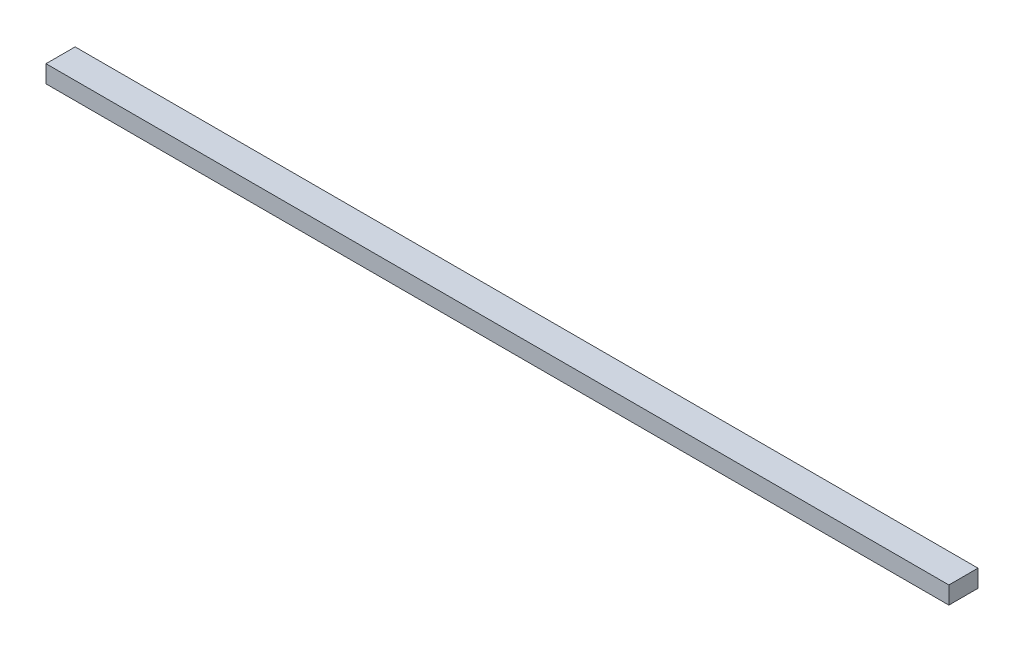
ISO-10303-21;
HEADER;
FILE_DESCRIPTION(('STEP AP214'),'2;1');
FILE_NAME('part.step','',(''),(''),'','','');
FILE_SCHEMA(('AUTOMOTIVE_DESIGN { 1 0 10303 214 1 1 1 1 }'));
ENDSEC;
DATA;
#1=APPLICATION_CONTEXT('core data for automotive mechanical design processes');
#2=APPLICATION_PROTOCOL_DEFINITION('international standard','automotive_design',2000,#1);
#3=PRODUCT_CONTEXT('',#1,'mechanical');
#4=PRODUCT('Part','Part','',(#3));
#5=PRODUCT_RELATED_PRODUCT_CATEGORY('part','',(#4));
#6=PRODUCT_DEFINITION_FORMATION('','',#4);
#7=PRODUCT_DEFINITION_CONTEXT('part definition',#1,'design');
#8=PRODUCT_DEFINITION('design','',#6,#7);
#9=PRODUCT_DEFINITION_SHAPE('','',#8);
#10=(LENGTH_UNIT() NAMED_UNIT(*) SI_UNIT(.MILLI.,.METRE.));
#11=(NAMED_UNIT(*) PLANE_ANGLE_UNIT() SI_UNIT($,.RADIAN.));
#12=(NAMED_UNIT(*) SI_UNIT($,.STERADIAN.) SOLID_ANGLE_UNIT());
#13=UNCERTAINTY_MEASURE_WITH_UNIT(LENGTH_MEASURE(1.E-05),#10,'distance_accuracy_value','');
#14=(GEOMETRIC_REPRESENTATION_CONTEXT(3) GLOBAL_UNCERTAINTY_ASSIGNED_CONTEXT((#13)) GLOBAL_UNIT_ASSIGNED_CONTEXT((#10,
#11,#12)) REPRESENTATION_CONTEXT('',''));
#15=CARTESIAN_POINT('',(0.,0.,0.));
#16=DIRECTION('',(0.,0.,1.));
#17=DIRECTION('',(1.,0.,0.));
#18=AXIS2_PLACEMENT_3D('',#15,#16,#17);
#19=CARTESIAN_POINT('',(77.5,3.,2.5));
#20=DIRECTION('',(-1.,0.,0.));
#21=DIRECTION('',(0.,0.,1.));
#22=AXIS2_PLACEMENT_3D('',#19,#20,#21);
#23=PLANE('',#22);
#24=DIRECTION('',(0.,0.,-1.));
#25=VECTOR('',#24,1.);
#26=CARTESIAN_POINT('',(77.5,0.,2.5));
#27=LINE('',#26,#25);
#28=CARTESIAN_POINT('',(77.5,0.,2.5));
#29=VERTEX_POINT('',#28);
#30=CARTESIAN_POINT('',(77.5,0.,-2.5));
#31=VERTEX_POINT('',#30);
#32=EDGE_CURVE('E94',#29,#31,#27,.T.);
#33=ORIENTED_EDGE('',*,*,#32,.T.);
#34=DIRECTION('',(0.,-1.,0.));
#35=VECTOR('',#34,1.);
#36=CARTESIAN_POINT('',(77.5,3.,-2.5));
#37=LINE('',#36,#35);
#38=CARTESIAN_POINT('',(77.5,3.,-2.5));
#39=VERTEX_POINT('',#38);
#40=EDGE_CURVE('E11',#39,#31,#37,.T.);
#41=ORIENTED_EDGE('',*,*,#40,.F.);
#42=DIRECTION('',(0.,0.,-1.));
#43=VECTOR('',#42,1.);
#44=CARTESIAN_POINT('',(77.5,3.,2.5));
#45=LINE('',#44,#43);
#46=CARTESIAN_POINT('',(77.5,3.,2.5));
#47=VERTEX_POINT('',#46);
#48=EDGE_CURVE('E82',#47,#39,#45,.T.);
#49=ORIENTED_EDGE('',*,*,#48,.F.);
#50=DIRECTION('',(0.,-1.,0.));
#51=VECTOR('',#50,1.);
#52=CARTESIAN_POINT('',(77.5,3.,2.5));
#53=LINE('',#52,#51);
#54=EDGE_CURVE('E90',#47,#29,#53,.T.);
#55=ORIENTED_EDGE('',*,*,#54,.T.);
#56=EDGE_LOOP('',(#33,#41,#49,#55));
#57=FACE_BOUND('',#56,.T.);
#58=ADVANCED_FACE('F31',(#57),#23,.F.);
#59=CARTESIAN_POINT('',(-77.5,3.,-2.5));
#60=DIRECTION('',(0.,0.,1.));
#61=DIRECTION('',(1.,0.,0.));
#62=AXIS2_PLACEMENT_3D('',#59,#60,#61);
#63=PLANE('',#62);
#64=DIRECTION('',(-1.,0.,0.));
#65=VECTOR('',#64,1.);
#66=CARTESIAN_POINT('',(-77.5,0.,-2.5));
#67=LINE('',#66,#65);
#68=CARTESIAN_POINT('',(-77.5,0.,-2.5));
#69=VERTEX_POINT('',#68);
#70=EDGE_CURVE('E86',#31,#69,#67,.T.);
#71=ORIENTED_EDGE('',*,*,#70,.T.);
#72=DIRECTION('',(0.,-1.,0.));
#73=VECTOR('',#72,1.);
#74=CARTESIAN_POINT('',(-77.5,3.,-2.5));
#75=LINE('',#74,#73);
#76=CARTESIAN_POINT('',(-77.5,3.,-2.5));
#77=VERTEX_POINT('',#76);
#78=EDGE_CURVE('E39',#77,#69,#75,.T.);
#79=ORIENTED_EDGE('',*,*,#78,.F.);
#80=DIRECTION('',(-1.,0.,0.));
#81=VECTOR('',#80,1.);
#82=CARTESIAN_POINT('',(-77.5,3.,-2.5));
#83=LINE('',#82,#81);
#84=EDGE_CURVE('E77',#39,#77,#83,.T.);
#85=ORIENTED_EDGE('',*,*,#84,.F.);
#86=ORIENTED_EDGE('',*,*,#40,.T.);
#87=EDGE_LOOP('',(#71,#79,#85,#86));
#88=FACE_BOUND('',#87,.T.);
#89=ADVANCED_FACE('F85',(#88),#63,.F.);
#90=CARTESIAN_POINT('',(-77.5,3.,2.5));
#91=DIRECTION('',(1.,0.,0.));
#92=DIRECTION('',(0.,0.,-1.));
#93=AXIS2_PLACEMENT_3D('',#90,#91,#92);
#94=PLANE('',#93);
#95=DIRECTION('',(0.,0.,1.));
#96=VECTOR('',#95,1.);
#97=CARTESIAN_POINT('',(-77.5,0.,2.5));
#98=LINE('',#97,#96);
#99=CARTESIAN_POINT('',(-77.5,0.,2.5));
#100=VERTEX_POINT('',#99);
#101=EDGE_CURVE('E64',#69,#100,#98,.T.);
#102=ORIENTED_EDGE('',*,*,#101,.T.);
#103=DIRECTION('',(0.,-1.,0.));
#104=VECTOR('',#103,1.);
#105=CARTESIAN_POINT('',(-77.5,3.,2.5));
#106=LINE('',#105,#104);
#107=CARTESIAN_POINT('',(-77.5,3.,2.5));
#108=VERTEX_POINT('',#107);
#109=EDGE_CURVE('E87',#108,#100,#106,.T.);
#110=ORIENTED_EDGE('',*,*,#109,.F.);
#111=DIRECTION('',(0.,0.,1.));
#112=VECTOR('',#111,1.);
#113=CARTESIAN_POINT('',(-77.5,3.,2.5));
#114=LINE('',#113,#112);
#115=EDGE_CURVE('E80',#77,#108,#114,.T.);
#116=ORIENTED_EDGE('',*,*,#115,.F.);
#117=ORIENTED_EDGE('',*,*,#78,.T.);
#118=EDGE_LOOP('',(#102,#110,#116,#117));
#119=FACE_BOUND('',#118,.T.);
#120=ADVANCED_FACE('F88',(#119),#94,.F.);
#121=CARTESIAN_POINT('',(-77.5,3.,2.5));
#122=DIRECTION('',(0.,0.,-1.));
#123=DIRECTION('',(-1.,0.,0.));
#124=AXIS2_PLACEMENT_3D('',#121,#122,#123);
#125=PLANE('',#124);
#126=DIRECTION('',(1.,0.,0.));
#127=VECTOR('',#126,1.);
#128=CARTESIAN_POINT('',(-77.5,0.,2.5));
#129=LINE('',#128,#127);
#130=EDGE_CURVE('E70',#100,#29,#129,.T.);
#131=ORIENTED_EDGE('',*,*,#130,.T.);
#132=ORIENTED_EDGE('',*,*,#54,.F.);
#133=DIRECTION('',(1.,0.,0.));
#134=VECTOR('',#133,1.);
#135=CARTESIAN_POINT('',(-77.5,3.,2.5));
#136=LINE('',#135,#134);
#137=EDGE_CURVE('E47',#108,#47,#136,.T.);
#138=ORIENTED_EDGE('',*,*,#137,.F.);
#139=ORIENTED_EDGE('',*,*,#109,.T.);
#140=EDGE_LOOP('',(#131,#132,#138,#139));
#141=FACE_BOUND('',#140,.T.);
#142=ADVANCED_FACE('F101',(#141),#125,.F.);
#143=CARTESIAN_POINT('',(77.5,3.,-2.5));
#144=DIRECTION('',(0.,-1.,0.));
#145=DIRECTION('',(0.,0.,-1.));
#146=AXIS2_PLACEMENT_3D('',#143,#144,#145);
#147=PLANE('',#146);
#148=ORIENTED_EDGE('',*,*,#48,.T.);
#149=ORIENTED_EDGE('',*,*,#84,.T.);
#150=ORIENTED_EDGE('',*,*,#115,.T.);
#151=ORIENTED_EDGE('',*,*,#137,.T.);
#152=EDGE_LOOP('',(#148,#149,#150,#151));
#153=FACE_BOUND('',#152,.T.);
#154=ADVANCED_FACE('F78',(#153),#147,.F.);
#155=CARTESIAN_POINT('',(77.5,0.,-2.5));
#156=DIRECTION('',(0.,-1.,0.));
#157=DIRECTION('',(0.,0.,-1.));
#158=AXIS2_PLACEMENT_3D('',#155,#156,#157);
#159=PLANE('',#158);
#160=ORIENTED_EDGE('',*,*,#32,.F.);
#161=ORIENTED_EDGE('',*,*,#130,.F.);
#162=ORIENTED_EDGE('',*,*,#101,.F.);
#163=ORIENTED_EDGE('',*,*,#70,.F.);
#164=EDGE_LOOP('',(#160,#161,#162,#163));
#165=FACE_BOUND('',#164,.T.);
#166=ADVANCED_FACE('F104',(#165),#159,.T.);
#167=CLOSED_SHELL('',(#58,#89,#120,#142,#154,#166));
#168=MANIFOLD_SOLID_BREP('B2',#167);
#169=ADVANCED_BREP_SHAPE_REPRESENTATION('',(#18,#168),#14);
#170=SHAPE_DEFINITION_REPRESENTATION(#9,#169);
ENDSEC;
END-ISO-10303-21;
